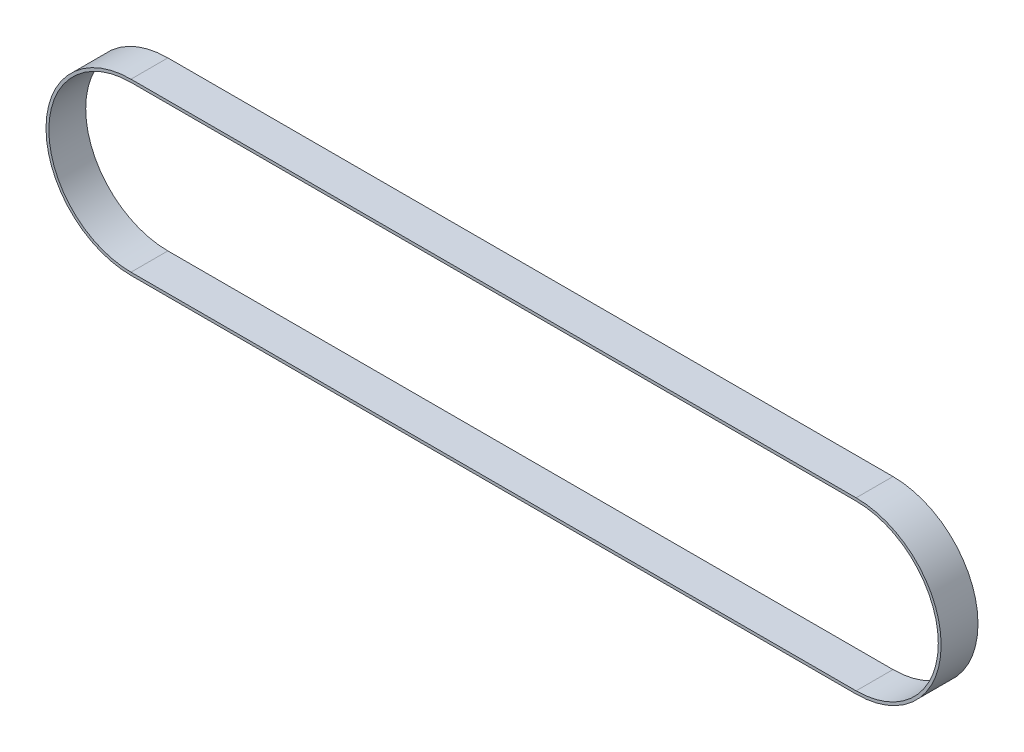
ISO-10303-21;
HEADER;
FILE_DESCRIPTION(('STEP AP214'),'2;1');
FILE_NAME('part.step','',(''),(''),'','','');
FILE_SCHEMA(('AUTOMOTIVE_DESIGN { 1 0 10303 214 1 1 1 1 }'));
ENDSEC;
DATA;
#1=APPLICATION_CONTEXT('core data for automotive mechanical design processes');
#2=APPLICATION_PROTOCOL_DEFINITION('international standard','automotive_design',2000,#1);
#3=PRODUCT_CONTEXT('',#1,'mechanical');
#4=PRODUCT('Part','Part','',(#3));
#5=PRODUCT_RELATED_PRODUCT_CATEGORY('part','',(#4));
#6=PRODUCT_DEFINITION_FORMATION('','',#4);
#7=PRODUCT_DEFINITION_CONTEXT('part definition',#1,'design');
#8=PRODUCT_DEFINITION('design','',#6,#7);
#9=PRODUCT_DEFINITION_SHAPE('','',#8);
#10=(LENGTH_UNIT() NAMED_UNIT(*) SI_UNIT(.MILLI.,.METRE.));
#11=(NAMED_UNIT(*) PLANE_ANGLE_UNIT() SI_UNIT($,.RADIAN.));
#12=(NAMED_UNIT(*) SI_UNIT($,.STERADIAN.) SOLID_ANGLE_UNIT());
#13=UNCERTAINTY_MEASURE_WITH_UNIT(LENGTH_MEASURE(1.E-05),#10,'distance_accuracy_value','');
#14=(GEOMETRIC_REPRESENTATION_CONTEXT(3) GLOBAL_UNCERTAINTY_ASSIGNED_CONTEXT((#13)) GLOBAL_UNIT_ASSIGNED_CONTEXT((#10,
#11,#12)) REPRESENTATION_CONTEXT('',''));
#15=CARTESIAN_POINT('',(0.,0.,0.));
#16=DIRECTION('',(0.,0.,1.));
#17=DIRECTION('',(1.,0.,0.));
#18=AXIS2_PLACEMENT_3D('',#15,#16,#17);
#19=CARTESIAN_POINT('',(-294.994029508292,-34.5781629969205,15.));
#20=DIRECTION('',(1.33460536998847E-05,0.999999999910941,0.));
#21=DIRECTION('',(-0.999999999910941,1.33460536998847E-05,0.));
#22=AXIS2_PLACEMENT_3D('',#19,#20,#21);
#23=PLANE('',#22);
#24=DIRECTION('',(0.,0.,-1.));
#25=VECTOR('',#24,1.);
#26=CARTESIAN_POINT('',(-0.000461534563652641,-34.5820999969202,15.));
#27=LINE('',#26,#25);
#28=CARTESIAN_POINT('',(-0.000461534563659045,-34.5820999969202,15.));
#29=VERTEX_POINT('',#28);
#30=CARTESIAN_POINT('',(-0.000461534563659045,-34.5820999969202,0.));
#31=VERTEX_POINT('',#30);
#32=EDGE_CURVE('E105',#29,#31,#27,.T.);
#33=ORIENTED_EDGE('',*,*,#32,.F.);
#34=DIRECTION('',(0.999999999910941,-1.33460536999082E-05,0.));
#35=VECTOR('',#34,1.);
#36=CARTESIAN_POINT('',(-294.994029508292,-34.5781629969205,15.));
#37=LINE('',#36,#35);
#38=CARTESIAN_POINT('',(-294.994029508292,-34.5781629969205,15.));
#39=VERTEX_POINT('',#38);
#40=EDGE_CURVE('E76',#39,#29,#37,.T.);
#41=ORIENTED_EDGE('',*,*,#40,.F.);
#42=DIRECTION('',(0.,0.,1.));
#43=VECTOR('',#42,1.);
#44=CARTESIAN_POINT('',(-294.994029508292,-34.5781629969205,15.));
#45=LINE('',#44,#43);
#46=CARTESIAN_POINT('',(-294.994029508292,-34.5781629969205,0.));
#47=VERTEX_POINT('',#46);
#48=EDGE_CURVE('E118',#47,#39,#45,.T.);
#49=ORIENTED_EDGE('',*,*,#48,.F.);
#50=DIRECTION('',(0.999999999910941,-1.33460536999082E-05,0.));
#51=VECTOR('',#50,1.);
#52=CARTESIAN_POINT('',(-294.994029508292,-34.5781629969205,0.));
#53=LINE('',#52,#51);
#54=EDGE_CURVE('E128',#47,#31,#53,.T.);
#55=ORIENTED_EDGE('',*,*,#54,.T.);
#56=EDGE_LOOP('',(#33,#41,#49,#55));
#57=FACE_BOUND('',#56,.T.);
#58=ADVANCED_FACE('F17',(#57),#23,.F.);
#59=CARTESIAN_POINT('',(-294.994014084258,-33.4224629970235,15.));
#60=DIRECTION('',(1.33460536998847E-05,0.999999999910941,0.));
#61=DIRECTION('',(-0.999999999910941,1.33460536998847E-05,0.));
#62=AXIS2_PLACEMENT_3D('',#59,#60,#61);
#63=PLANE('',#62);
#64=DIRECTION('',(-0.999999999910941,1.33460536998612E-05,0.));
#65=VECTOR('',#64,1.);
#66=CARTESIAN_POINT('',(-0.000446110529406241,-33.4263999970231,15.));
#67=LINE('',#66,#65);
#68=CARTESIAN_POINT('',(-0.000446110529392397,-33.4263999970231,15.));
#69=VERTEX_POINT('',#68);
#70=CARTESIAN_POINT('',(-294.994014084258,-33.4224629970235,15.));
#71=VERTEX_POINT('',#70);
#72=EDGE_CURVE('E98',#69,#71,#67,.T.);
#73=ORIENTED_EDGE('',*,*,#72,.F.);
#74=DIRECTION('',(0.,0.,-1.));
#75=VECTOR('',#74,1.);
#76=CARTESIAN_POINT('',(-0.000446110529391756,-33.4263999970231,15.));
#77=LINE('',#76,#75);
#78=CARTESIAN_POINT('',(-0.000446110529393184,-33.4263999970231,0.));
#79=VERTEX_POINT('',#78);
#80=EDGE_CURVE('E106',#69,#79,#77,.T.);
#81=ORIENTED_EDGE('',*,*,#80,.T.);
#82=DIRECTION('',(-0.999999999910941,1.33460536999082E-05,0.));
#83=VECTOR('',#82,1.);
#84=CARTESIAN_POINT('',(-0.000446110529406241,-33.4263999970231,0.));
#85=LINE('',#84,#83);
#86=CARTESIAN_POINT('',(-294.994014084258,-33.4224629970235,0.));
#87=VERTEX_POINT('',#86);
#88=EDGE_CURVE('E125',#79,#87,#85,.T.);
#89=ORIENTED_EDGE('',*,*,#88,.T.);
#90=DIRECTION('',(0.,0.,-1.));
#91=VECTOR('',#90,1.);
#92=CARTESIAN_POINT('',(-294.994014084258,-33.4224629970235,15.));
#93=LINE('',#92,#91);
#94=EDGE_CURVE('E115',#87,#71,#93,.F.);
#95=ORIENTED_EDGE('',*,*,#94,.T.);
#96=EDGE_LOOP('',(#73,#81,#89,#95));
#97=FACE_BOUND('',#96,.T.);
#98=ADVANCED_FACE('F140',(#97),#63,.T.);
#99=CARTESIAN_POINT('',(-294.993568026272,0.,15.));
#100=DIRECTION('',(0.,0.,-1.));
#101=DIRECTION('',(-1.,0.,0.));
#102=AXIS2_PLACEMENT_3D('',#99,#100,#101);
#103=CYLINDRICAL_SURFACE('',#102,33.422463);
#104=CARTESIAN_POINT('',(-294.993568026272,0.,15.));
#105=DIRECTION('',(0.,0.,-1.));
#106=DIRECTION('',(-1.,0.,0.));
#107=AXIS2_PLACEMENT_3D('',#104,#105,#106);
#108=CIRCLE('',#107,33.422463);
#109=CARTESIAN_POINT('',(-294.994014084258,33.4224629970235,15.));
#110=VERTEX_POINT('',#109);
#111=EDGE_CURVE('E101',#71,#110,#108,.T.);
#112=ORIENTED_EDGE('',*,*,#111,.F.);
#113=ORIENTED_EDGE('',*,*,#94,.F.);
#114=CARTESIAN_POINT('',(-294.993568026272,0.,0.));
#115=DIRECTION('',(0.,0.,-1.));
#116=DIRECTION('',(-1.,0.,0.));
#117=AXIS2_PLACEMENT_3D('',#114,#115,#116);
#118=CIRCLE('',#117,33.422463);
#119=CARTESIAN_POINT('',(-294.994014084258,33.4224629970235,0.));
#120=VERTEX_POINT('',#119);
#121=EDGE_CURVE('E122',#87,#120,#118,.T.);
#122=ORIENTED_EDGE('',*,*,#121,.T.);
#123=DIRECTION('',(0.,0.,1.));
#124=VECTOR('',#123,1.);
#125=CARTESIAN_POINT('',(-294.994014084258,33.4224629970235,15.));
#126=LINE('',#125,#124);
#127=EDGE_CURVE('E112',#110,#120,#126,.F.);
#128=ORIENTED_EDGE('',*,*,#127,.F.);
#129=EDGE_LOOP('',(#112,#113,#122,#128));
#130=FACE_BOUND('',#129,.T.);
#131=ADVANCED_FACE('F145',(#130),#103,.F.);
#132=CARTESIAN_POINT('',(-294.994014084258,33.4224629970235,15.));
#133=DIRECTION('',(1.33460536998847E-05,-0.999999999910941,0.));
#134=DIRECTION('',(0.999999999910941,1.33460536998847E-05,0.));
#135=AXIS2_PLACEMENT_3D('',#132,#133,#134);
#136=PLANE('',#135);
#137=DIRECTION('',(0.999999999910941,1.33460536998847E-05,0.));
#138=VECTOR('',#137,1.);
#139=CARTESIAN_POINT('',(-294.994014084258,33.4224629970235,15.));
#140=LINE('',#139,#138);
#141=CARTESIAN_POINT('',(-0.000446110529396603,33.4263999970231,15.));
#142=VERTEX_POINT('',#141);
#143=EDGE_CURVE('E80',#110,#142,#140,.T.);
#144=ORIENTED_EDGE('',*,*,#143,.F.);
#145=ORIENTED_EDGE('',*,*,#127,.T.);
#146=DIRECTION('',(0.999999999910941,1.33460536998847E-05,0.));
#147=VECTOR('',#146,1.);
#148=CARTESIAN_POINT('',(-294.994014084258,33.4224629970235,0.));
#149=LINE('',#148,#147);
#150=CARTESIAN_POINT('',(-0.000446110529396603,33.4263999970231,0.));
#151=VERTEX_POINT('',#150);
#152=EDGE_CURVE('E94',#120,#151,#149,.T.);
#153=ORIENTED_EDGE('',*,*,#152,.T.);
#154=DIRECTION('',(0.,0.,-1.));
#155=VECTOR('',#154,1.);
#156=CARTESIAN_POINT('',(-0.000446110529392521,33.4263999970231,15.));
#157=LINE('',#156,#155);
#158=EDGE_CURVE('E109',#151,#142,#157,.F.);
#159=ORIENTED_EDGE('',*,*,#158,.T.);
#160=EDGE_LOOP('',(#144,#145,#153,#159));
#161=FACE_BOUND('',#160,.T.);
#162=ADVANCED_FACE('F157',(#161),#136,.T.);
#163=CARTESIAN_POINT('',(0.,0.,15.));
#164=DIRECTION('',(0.,0.,-1.));
#165=DIRECTION('',(-1.,0.,0.));
#166=AXIS2_PLACEMENT_3D('',#163,#164,#165);
#167=CYLINDRICAL_SURFACE('',#166,33.4264);
#168=ORIENTED_EDGE('',*,*,#80,.F.);
#169=CARTESIAN_POINT('',(0.,0.,15.));
#170=DIRECTION('',(0.,0.,-1.));
#171=DIRECTION('',(-1.,0.,0.));
#172=AXIS2_PLACEMENT_3D('',#169,#170,#171);
#173=CIRCLE('',#172,33.4264);
#174=EDGE_CURVE('E102',#142,#69,#173,.T.);
#175=ORIENTED_EDGE('',*,*,#174,.F.);
#176=ORIENTED_EDGE('',*,*,#158,.F.);
#177=CARTESIAN_POINT('',(0.,0.,0.));
#178=DIRECTION('',(0.,0.,-1.));
#179=DIRECTION('',(-1.,0.,0.));
#180=AXIS2_PLACEMENT_3D('',#177,#178,#179);
#181=CIRCLE('',#180,33.4264);
#182=EDGE_CURVE('E91',#151,#79,#181,.T.);
#183=ORIENTED_EDGE('',*,*,#182,.T.);
#184=EDGE_LOOP('',(#168,#175,#176,#183));
#185=FACE_BOUND('',#184,.T.);
#186=ADVANCED_FACE('F153',(#185),#167,.F.);
#187=CARTESIAN_POINT('',(0.,0.,15.));
#188=DIRECTION('',(0.,0.,-1.));
#189=DIRECTION('',(-1.,0.,0.));
#190=AXIS2_PLACEMENT_3D('',#187,#188,#189);
#191=CYLINDRICAL_SURFACE('',#190,34.5821);
#192=CARTESIAN_POINT('',(0.,0.,15.));
#193=DIRECTION('',(0.,0.,-1.));
#194=DIRECTION('',(-1.,0.,0.));
#195=AXIS2_PLACEMENT_3D('',#192,#193,#194);
#196=CIRCLE('',#195,34.5821);
#197=CARTESIAN_POINT('',(-0.000461534563611415,34.5820999969202,15.));
#198=VERTEX_POINT('',#197);
#199=EDGE_CURVE('E20',#29,#198,#196,.F.);
#200=ORIENTED_EDGE('',*,*,#199,.F.);
#201=ORIENTED_EDGE('',*,*,#32,.T.);
#202=CARTESIAN_POINT('',(0.,0.,0.));
#203=DIRECTION('',(0.,0.,-1.));
#204=DIRECTION('',(-1.,0.,0.));
#205=AXIS2_PLACEMENT_3D('',#202,#203,#204);
#206=CIRCLE('',#205,34.5821);
#207=CARTESIAN_POINT('',(-0.000461534563611415,34.5820999969202,0.));
#208=VERTEX_POINT('',#207);
#209=EDGE_CURVE('E90',#31,#208,#206,.F.);
#210=ORIENTED_EDGE('',*,*,#209,.T.);
#211=DIRECTION('',(0.,0.,1.));
#212=VECTOR('',#211,1.);
#213=CARTESIAN_POINT('',(-0.000461534563567234,34.5820999969202,15.));
#214=LINE('',#213,#212);
#215=EDGE_CURVE('E84',#208,#198,#214,.T.);
#216=ORIENTED_EDGE('',*,*,#215,.T.);
#217=EDGE_LOOP('',(#200,#201,#210,#216));
#218=FACE_BOUND('',#217,.T.);
#219=ADVANCED_FACE('F88',(#218),#191,.T.);
#220=CARTESIAN_POINT('',(-294.993568026272,0.,15.));
#221=DIRECTION('',(0.,0.,1.));
#222=DIRECTION('',(1.,0.,0.));
#223=AXIS2_PLACEMENT_3D('',#220,#221,#222);
#224=PLANE('',#223);
#225=ORIENTED_EDGE('',*,*,#72,.T.);
#226=ORIENTED_EDGE('',*,*,#111,.T.);
#227=ORIENTED_EDGE('',*,*,#143,.T.);
#228=ORIENTED_EDGE('',*,*,#174,.T.);
#229=EDGE_LOOP('',(#225,#226,#227,#228));
#230=FACE_BOUND('',#229,.T.);
#231=ORIENTED_EDGE('',*,*,#199,.T.);
#232=DIRECTION('',(0.999999999910941,1.33460536999082E-05,0.));
#233=VECTOR('',#232,1.);
#234=CARTESIAN_POINT('',(-294.994029508292,34.5781629969205,15.));
#235=LINE('',#234,#233);
#236=CARTESIAN_POINT('',(-294.994029508292,34.5781629969205,15.));
#237=VERTEX_POINT('',#236);
#238=EDGE_CURVE('E74',#198,#237,#235,.F.);
#239=ORIENTED_EDGE('',*,*,#238,.T.);
#240=CARTESIAN_POINT('',(-294.993568026272,0.,15.));
#241=DIRECTION('',(0.,0.,-1.));
#242=DIRECTION('',(-1.,0.,0.));
#243=AXIS2_PLACEMENT_3D('',#240,#241,#242);
#244=CIRCLE('',#243,34.578163);
#245=EDGE_CURVE('E129',#39,#237,#244,.T.);
#246=ORIENTED_EDGE('',*,*,#245,.F.);
#247=ORIENTED_EDGE('',*,*,#40,.T.);
#248=EDGE_LOOP('',(#231,#239,#246,#247));
#249=FACE_BOUND('',#248,.T.);
#250=ADVANCED_FACE('F72',(#230,#249),#224,.T.);
#251=CARTESIAN_POINT('',(-294.993568026272,0.,15.));
#252=DIRECTION('',(0.,0.,-1.));
#253=DIRECTION('',(-1.,0.,0.));
#254=AXIS2_PLACEMENT_3D('',#251,#252,#253);
#255=CYLINDRICAL_SURFACE('',#254,34.578163);
#256=DIRECTION('',(0.,0.,1.));
#257=VECTOR('',#256,1.);
#258=CARTESIAN_POINT('',(-294.994029508292,34.5781629969205,15.));
#259=LINE('',#258,#257);
#260=CARTESIAN_POINT('',(-294.994029508292,34.5781629969205,0.));
#261=VERTEX_POINT('',#260);
#262=EDGE_CURVE('E26',#237,#261,#259,.F.);
#263=ORIENTED_EDGE('',*,*,#262,.T.);
#264=CARTESIAN_POINT('',(-294.993568026272,0.,0.));
#265=DIRECTION('',(0.,0.,-1.));
#266=DIRECTION('',(-1.,0.,0.));
#267=AXIS2_PLACEMENT_3D('',#264,#265,#266);
#268=CIRCLE('',#267,34.578163);
#269=EDGE_CURVE('E34',#261,#47,#268,.F.);
#270=ORIENTED_EDGE('',*,*,#269,.T.);
#271=ORIENTED_EDGE('',*,*,#48,.T.);
#272=ORIENTED_EDGE('',*,*,#245,.T.);
#273=EDGE_LOOP('',(#263,#270,#271,#272));
#274=FACE_BOUND('',#273,.T.);
#275=ADVANCED_FACE('F163',(#274),#255,.T.);
#276=CARTESIAN_POINT('',(-294.993568026272,0.,0.));
#277=DIRECTION('',(0.,0.,1.));
#278=DIRECTION('',(1.,0.,0.));
#279=AXIS2_PLACEMENT_3D('',#276,#277,#278);
#280=PLANE('',#279);
#281=ORIENTED_EDGE('',*,*,#152,.F.);
#282=ORIENTED_EDGE('',*,*,#121,.F.);
#283=ORIENTED_EDGE('',*,*,#88,.F.);
#284=ORIENTED_EDGE('',*,*,#182,.F.);
#285=EDGE_LOOP('',(#281,#282,#283,#284));
#286=FACE_BOUND('',#285,.T.);
#287=DIRECTION('',(0.999999999910941,1.33460536999082E-05,0.));
#288=VECTOR('',#287,1.);
#289=CARTESIAN_POINT('',(-294.994029508292,34.5781629969205,0.));
#290=LINE('',#289,#288);
#291=EDGE_CURVE('E11',#261,#208,#290,.T.);
#292=ORIENTED_EDGE('',*,*,#291,.T.);
#293=ORIENTED_EDGE('',*,*,#209,.F.);
#294=ORIENTED_EDGE('',*,*,#54,.F.);
#295=ORIENTED_EDGE('',*,*,#269,.F.);
#296=EDGE_LOOP('',(#292,#293,#294,#295));
#297=FACE_BOUND('',#296,.T.);
#298=ADVANCED_FACE('F156',(#286,#297),#280,.F.);
#299=CARTESIAN_POINT('',(-294.994029508292,34.5781629969205,15.));
#300=DIRECTION('',(1.33460536999082E-05,-0.999999999910941,0.));
#301=DIRECTION('',(0.999999999910941,1.33460536999082E-05,0.));
#302=AXIS2_PLACEMENT_3D('',#299,#300,#301);
#303=PLANE('',#302);
#304=ORIENTED_EDGE('',*,*,#262,.F.);
#305=ORIENTED_EDGE('',*,*,#238,.F.);
#306=ORIENTED_EDGE('',*,*,#215,.F.);
#307=ORIENTED_EDGE('',*,*,#291,.F.);
#308=EDGE_LOOP('',(#304,#305,#306,#307));
#309=FACE_BOUND('',#308,.T.);
#310=ADVANCED_FACE('F83',(#309),#303,.F.);
#311=CLOSED_SHELL('',(#58,#98,#131,#162,#186,#219,#250,#275,#298,#310));
#312=MANIFOLD_SOLID_BREP('B1',#311);
#313=ADVANCED_BREP_SHAPE_REPRESENTATION('',(#18,#312),#14);
#314=SHAPE_DEFINITION_REPRESENTATION(#9,#313);
ENDSEC;
END-ISO-10303-21;
